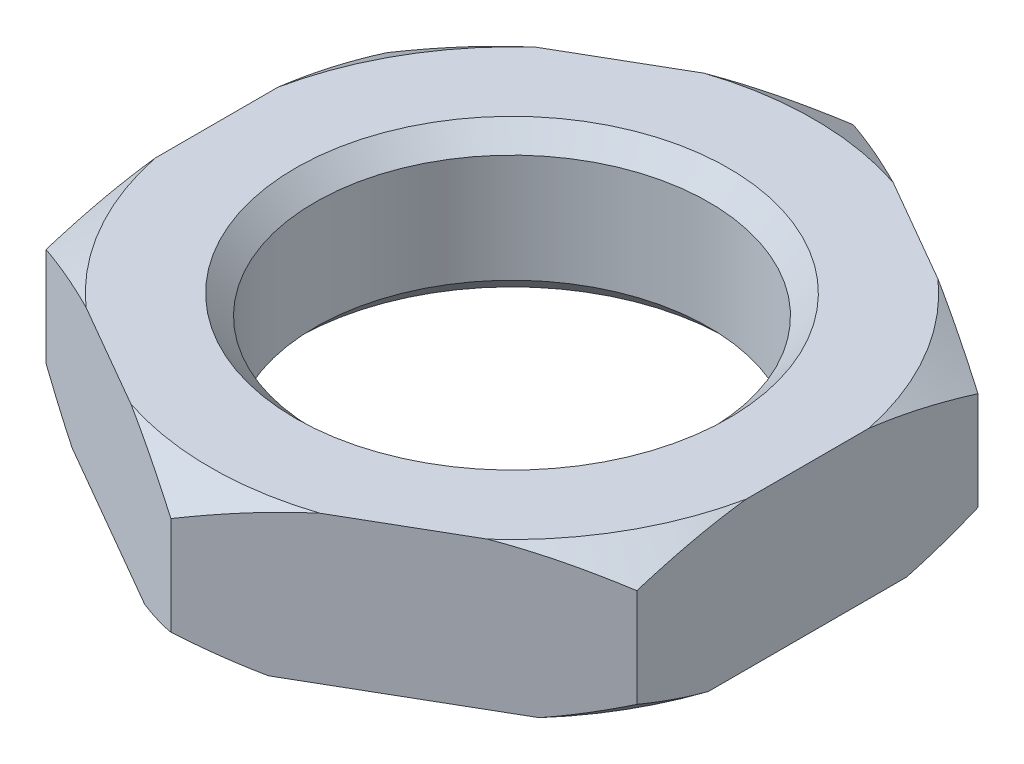
ISO-10303-21;
HEADER;
FILE_DESCRIPTION(('STEP AP214'),'2;1');
FILE_NAME('part.step','',(''),(''),'','','');
FILE_SCHEMA(('AUTOMOTIVE_DESIGN { 1 0 10303 214 1 1 1 1 }'));
ENDSEC;
DATA;
#1=APPLICATION_CONTEXT('core data for automotive mechanical design processes');
#2=APPLICATION_PROTOCOL_DEFINITION('international standard','automotive_design',2000,#1);
#3=PRODUCT_CONTEXT('',#1,'mechanical');
#4=PRODUCT('Part','Part','',(#3));
#5=PRODUCT_RELATED_PRODUCT_CATEGORY('part','',(#4));
#6=PRODUCT_DEFINITION_FORMATION('','',#4);
#7=PRODUCT_DEFINITION_CONTEXT('part definition',#1,'design');
#8=PRODUCT_DEFINITION('design','',#6,#7);
#9=PRODUCT_DEFINITION_SHAPE('','',#8);
#10=(LENGTH_UNIT() NAMED_UNIT(*) SI_UNIT(.MILLI.,.METRE.));
#11=(NAMED_UNIT(*) PLANE_ANGLE_UNIT() SI_UNIT($,.RADIAN.));
#12=(NAMED_UNIT(*) SI_UNIT($,.STERADIAN.) SOLID_ANGLE_UNIT());
#13=UNCERTAINTY_MEASURE_WITH_UNIT(LENGTH_MEASURE(1.E-05),#10,'distance_accuracy_value','');
#14=(GEOMETRIC_REPRESENTATION_CONTEXT(3) GLOBAL_UNCERTAINTY_ASSIGNED_CONTEXT((#13)) GLOBAL_UNIT_ASSIGNED_CONTEXT((#10,
#11,#12)) REPRESENTATION_CONTEXT('',''));
#15=CARTESIAN_POINT('',(0.,0.,0.));
#16=DIRECTION('',(0.,0.,1.));
#17=DIRECTION('',(1.,0.,0.));
#18=AXIS2_PLACEMENT_3D('',#15,#16,#17);
#19=CARTESIAN_POINT('',(0.,1.5,0.));
#20=DIRECTION('',(0.,1.,0.));
#21=DIRECTION('',(0.,0.,1.));
#22=AXIS2_PLACEMENT_3D('',#19,#20,#21);
#23=PLANE('',#22);
#24=CARTESIAN_POINT('',(0.,1.5,0.));
#25=DIRECTION('',(0.,1.,0.));
#26=DIRECTION('',(0.,0.,1.));
#27=AXIS2_PLACEMENT_3D('',#24,#25,#26);
#28=CIRCLE('',#27,2.2);
#29=CARTESIAN_POINT('',(0.,1.5,2.2));
#30=VERTEX_POINT('',#29);
#31=EDGE_CURVE('E207',#30,#30,#28,.F.);
#32=ORIENTED_EDGE('',*,*,#31,.T.);
#33=EDGE_LOOP('',(#32));
#34=FACE_BOUND('',#33,.T.);
#35=CARTESIAN_POINT('',(0.,1.5,0.));
#36=DIRECTION('',(0.,1.,0.));
#37=DIRECTION('',(0.,0.,1.));
#38=AXIS2_PLACEMENT_3D('',#35,#36,#37);
#39=CIRCLE('',#38,3.06410161513776);
#40=CARTESIAN_POINT('',(-2.03994354419448,1.5,2.28633966076545));
#41=VERTEX_POINT('',#40);
#42=CARTESIAN_POINT('',(-2.99999999999999,1.5,0.623473101175866));
#43=VERTEX_POINT('',#42);
#44=EDGE_CURVE('E11',#41,#43,#39,.F.);
#45=ORIENTED_EDGE('',*,*,#44,.F.);
#46=DIRECTION('',(0.866025403784441,0.,0.499999999999995));
#47=VECTOR('',#46,1.);
#48=CARTESIAN_POINT('',(-2.99999999999998,1.5,1.73205080756891));
#49=LINE('',#48,#47);
#50=CARTESIAN_POINT('',(-0.960056455805504,1.5,2.90981276194122));
#51=VERTEX_POINT('',#50);
#52=EDGE_CURVE('E255',#41,#51,#49,.T.);
#53=ORIENTED_EDGE('',*,*,#52,.T.);
#54=CARTESIAN_POINT('',(0.960056455805468,1.5,2.90981276194123));
#55=VERTEX_POINT('',#54);
#56=EDGE_CURVE('E46',#55,#51,#39,.F.);
#57=ORIENTED_EDGE('',*,*,#56,.F.);
#58=DIRECTION('',(0.866025403784438,0.,-0.500000000000001));
#59=VECTOR('',#58,1.);
#60=CARTESIAN_POINT('',(0.,1.5,3.46410161513776));
#61=LINE('',#60,#59);
#62=CARTESIAN_POINT('',(2.03994354419454,1.5,2.2863396607654));
#63=VERTEX_POINT('',#62);
#64=EDGE_CURVE('E289',#55,#63,#61,.T.);
#65=ORIENTED_EDGE('',*,*,#64,.T.);
#66=CARTESIAN_POINT('',(3.,1.5,0.623473101175824));
#67=VERTEX_POINT('',#66);
#68=EDGE_CURVE('E221',#67,#63,#39,.F.);
#69=ORIENTED_EDGE('',*,*,#68,.F.);
#70=DIRECTION('',(0.,0.,-1.));
#71=VECTOR('',#70,1.);
#72=CARTESIAN_POINT('',(3.00000000000001,1.5,1.73205080756887));
#73=LINE('',#72,#71);
#74=CARTESIAN_POINT('',(3.,1.5,-0.623473101175845));
#75=VERTEX_POINT('',#74);
#76=EDGE_CURVE('E277',#67,#75,#73,.T.);
#77=ORIENTED_EDGE('',*,*,#76,.T.);
#78=CARTESIAN_POINT('',(2.03994354419453,1.5,-2.28633966076541));
#79=VERTEX_POINT('',#78);
#80=EDGE_CURVE('E286',#79,#75,#39,.F.);
#81=ORIENTED_EDGE('',*,*,#80,.F.);
#82=DIRECTION('',(-0.866025403784442,0.,-0.499999999999995));
#83=VECTOR('',#82,1.);
#84=CARTESIAN_POINT('',(2.99999999999999,1.5,-1.73205080756889));
#85=LINE('',#84,#83);
#86=CARTESIAN_POINT('',(0.960056455805444,1.5,-2.90981276194124));
#87=VERTEX_POINT('',#86);
#88=EDGE_CURVE('E288',#79,#87,#85,.T.);
#89=ORIENTED_EDGE('',*,*,#88,.T.);
#90=CARTESIAN_POINT('',(-0.960056455805485,1.5,-2.90981276194123));
#91=VERTEX_POINT('',#90);
#92=EDGE_CURVE('E654',#91,#87,#39,.F.);
#93=ORIENTED_EDGE('',*,*,#92,.F.);
#94=DIRECTION('',(-0.866025403784435,0.,0.500000000000007));
#95=VECTOR('',#94,1.);
#96=CARTESIAN_POINT('',(0.,1.5,-3.46410161513776));
#97=LINE('',#96,#95);
#98=CARTESIAN_POINT('',(-2.03994354419456,1.5,-2.28633966076538));
#99=VERTEX_POINT('',#98);
#100=EDGE_CURVE('E291',#91,#99,#97,.T.);
#101=ORIENTED_EDGE('',*,*,#100,.T.);
#102=CARTESIAN_POINT('',(-3.00000000000001,1.5,-0.623473101175803));
#103=VERTEX_POINT('',#102);
#104=EDGE_CURVE('E51',#103,#99,#39,.F.);
#105=ORIENTED_EDGE('',*,*,#104,.F.);
#106=DIRECTION('',(0.,0.,1.));
#107=VECTOR('',#106,1.);
#108=CARTESIAN_POINT('',(-3.00000000000002,1.5,-1.73205080756885));
#109=LINE('',#108,#107);
#110=EDGE_CURVE('E260',#103,#43,#109,.T.);
#111=ORIENTED_EDGE('',*,*,#110,.T.);
#112=EDGE_LOOP('',(#45,#53,#57,#65,#69,#77,#81,#89,#93,#101,#105,#111));
#113=FACE_BOUND('',#112,.T.);
#114=ADVANCED_FACE('F41',(#34,#113),#23,.T.);
#115=CARTESIAN_POINT('',(-2.99999999999998,1.5,1.73205080756891));
#116=DIRECTION('',(0.499999999999995,0.,-0.866025403784441));
#117=DIRECTION('',(-0.866025403784442,0.,-0.499999999999995));
#118=AXIS2_PLACEMENT_3D('',#115,#116,#117);
#119=PLANE('',#118);
#120=DIRECTION('',(0.,-1.,0.));
#121=VECTOR('',#120,1.);
#122=CARTESIAN_POINT('',(0.,1.5,3.46410161513776));
#123=LINE('',#122,#121);
#124=CARTESIAN_POINT('',(0.,1.25,3.46410161513776));
#125=VERTEX_POINT('',#124);
#126=CARTESIAN_POINT('',(0.,0.25,3.46410161513776));
#127=VERTEX_POINT('',#126);
#128=EDGE_CURVE('E183',#125,#127,#123,.T.);
#129=ORIENTED_EDGE('',*,*,#128,.F.);
#130=CARTESIAN_POINT('',(0.0007,1.24974736505901,3.46450576032619));
#131=CARTESIAN_POINT('',(-0.132118584401436,1.29770203539369,3.38782291486864));
#132=CARTESIAN_POINT('',(-0.266280677223476,1.34135896938019,3.31036439446279));
#133=CARTESIAN_POINT('',(-0.537346844665793,1.41752411455504,3.15386426972177));
#134=CARTESIAN_POINT('',(-0.67425778770567,1.44999936573445,3.07481869990269));
#135=CARTESIAN_POINT('',(-0.946088347128595,1.5001961423526,2.9178772532459));
#136=CARTESIAN_POINT('',(-1.08095021548076,1.51831897963956,2.84001471724937));
#137=CARTESIAN_POINT('',(-1.35138509389356,1.53949642488741,2.68387906739947));
#138=CARTESIAN_POINT('',(-1.48695672552565,1.54257370569254,2.60560674938221));
#139=CARTESIAN_POINT('',(-1.7378739905643,1.53407074016064,2.46073959886782));
#140=CARTESIAN_POINT('',(-1.85327732637306,1.52456876159411,2.39411145187326));
#141=CARTESIAN_POINT('',(-2.083195561863,1.4951434282713,2.26136809672154));
#142=CARTESIAN_POINT('',(-2.19770934249718,1.47520860211639,2.19525353464647));
#143=CARTESIAN_POINT('',(-2.42815317242588,1.4256333431407,2.06220672740405));
#144=CARTESIAN_POINT('',(-2.54404411755596,1.39575690138364,1.99529705903656));
#145=CARTESIAN_POINT('',(-2.77383098348567,1.32819178909225,1.8626295501358));
#146=CARTESIAN_POINT('',(-2.88773092971335,1.29052151704235,1.79686938552057));
#147=CARTESIAN_POINT('',(-3.00069999999998,1.24974736505901,1.73164666238048));
#148=B_SPLINE_CURVE_WITH_KNOTS('',3,(#130,#131,#132,#133,#134,#135,#136,#137,#138,#139,#140,
#141,#142,#143,#144,#145,#146,#147),.UNSPECIFIED.,.F.,.F.,(4,2,2,2,2,2,2,2,4),(0.,
0.482303869776431,0.966017483756613,1.43567462842446,1.90462380643614,2.30497469449498,
2.70576671462179,3.11684716030584,3.52696804141059),.UNSPECIFIED.);
#149=EDGE_CURVE('E299',#125,#51,#148,.T.);
#150=ORIENTED_EDGE('',*,*,#149,.T.);
#151=ORIENTED_EDGE('',*,*,#52,.F.);
#152=CARTESIAN_POINT('',(-2.99999999999998,1.25,1.73205080756891));
#153=VERTEX_POINT('',#152);
#154=EDGE_CURVE('E301',#41,#153,#148,.T.);
#155=ORIENTED_EDGE('',*,*,#154,.T.);
#156=DIRECTION('',(0.,-1.,0.));
#157=VECTOR('',#156,1.);
#158=CARTESIAN_POINT('',(-2.99999999999998,1.5,1.73205080756891));
#159=LINE('',#158,#157);
#160=CARTESIAN_POINT('',(-2.99999999999998,0.25,1.73205080756891));
#161=VERTEX_POINT('',#160);
#162=EDGE_CURVE('E256',#153,#161,#159,.T.);
#163=ORIENTED_EDGE('',*,*,#162,.T.);
#164=CARTESIAN_POINT('',(-3.00069999999998,0.250336846587991,1.73164666238048));
#165=CARTESIAN_POINT('',(-2.89915494804903,0.201488907967232,1.79027372545924));
#166=CARTESIAN_POINT('',(-2.79638007383815,0.155716884952471,1.84961082675082));
#167=CARTESIAN_POINT('',(-2.58808496863268,0.0720995554684667,1.96987006181207));
#168=CARTESIAN_POINT('',(-2.48255693377003,0.0342803638316828,2.03079670114708));
#169=CARTESIAN_POINT('',(-2.27010836935601,-0.0310140637447712,2.15345393700046));
#170=CARTESIAN_POINT('',(-2.16320956222869,-0.0585812039591016,2.21517199207147));
#171=CARTESIAN_POINT('',(-1.947730613772,-0.101921714201025,2.33957882096764));
#172=CARTESIAN_POINT('',(-1.83915269499159,-0.117709505311277,2.40226631160355));
#173=CARTESIAN_POINT('',(-1.61928750206901,-0.136371223661096,2.52920553992283));
#174=CARTESIAN_POINT('',(-1.50798552662789,-0.139021344575427,2.5934657654051));
#175=CARTESIAN_POINT('',(-1.28573745900257,-0.13054306524596,2.72178074707545));
#176=CARTESIAN_POINT('',(-1.17479154946977,-0.119408465179738,2.7858353978097));
#177=CARTESIAN_POINT('',(-0.954465542969872,-0.0843771979488909,2.91304067697189));
#178=CARTESIAN_POINT('',(-0.845085413561052,-0.0604807955928022,2.97619132413006));
#179=CARTESIAN_POINT('',(-0.628542084799696,-0.00176156356192382,3.10121267328165));
#180=CARTESIAN_POINT('',(-0.521379827290569,0.0330658105450128,3.16308283150151));
#181=CARTESIAN_POINT('',(-0.344899381794173,0.0984796604321558,3.26497386421556));
#182=CARTESIAN_POINT('',(-0.274879393082677,0.126606688526461,3.3053999235468));
#183=CARTESIAN_POINT('',(-0.136168400788723,0.18613972375121,3.38548475228727));
#184=CARTESIAN_POINT('',(-0.0674736021716006,0.217533904380575,3.42514571276079));
#185=CARTESIAN_POINT('',(0.00070000000003283,0.250336846587874,3.46450576032621));
#186=B_SPLINE_CURVE_WITH_KNOTS('',3,(#164,#165,#166,#167,#168,#169,#170,#171,#172,#173,#174,
#175,#176,#177,#178,#179,#180,#181,#182,#183,#184,#185),.UNSPECIFIED.,.F.,.F.,(4,2,2,2,2,2,2,2,
2,2,4),(0.,0.38121603524856,0.763664974742394,1.14259772670861,1.52106579867398,
1.90595961058781,2.29102659542605,2.67608559040046,3.06130488196879,3.31804931282741,
3.57389473057061),.UNSPECIFIED.);
#187=CARTESIAN_POINT('',(-2.37100761947756,0.,2.09519972778175));
#188=VERTEX_POINT('',#187);
#189=EDGE_CURVE('E188',#161,#188,#186,.T.);
#190=ORIENTED_EDGE('',*,*,#189,.T.);
#191=DIRECTION('',(0.866025403784441,0.,0.499999999999995));
#192=VECTOR('',#191,1.);
#193=CARTESIAN_POINT('',(-2.99999999999998,0.,1.73205080756891));
#194=LINE('',#193,#192);
#195=CARTESIAN_POINT('',(-0.628992380522426,0.,3.10095269492492));
#196=VERTEX_POINT('',#195);
#197=EDGE_CURVE('E186',#188,#196,#194,.T.);
#198=ORIENTED_EDGE('',*,*,#197,.T.);
#199=EDGE_CURVE('E169',#196,#127,#186,.T.);
#200=ORIENTED_EDGE('',*,*,#199,.T.);
#201=EDGE_LOOP('',(#129,#150,#151,#155,#163,#190,#198,#200));
#202=FACE_BOUND('',#201,.T.);
#203=ADVANCED_FACE('F181',(#202),#119,.F.);
#204=CARTESIAN_POINT('',(0.,1.5,3.46410161513776));
#205=DIRECTION('',(-0.500000000000001,0.,-0.866025403784438));
#206=DIRECTION('',(-0.866025403784438,0.,0.500000000000001));
#207=AXIS2_PLACEMENT_3D('',#204,#205,#206);
#208=PLANE('',#207);
#209=DIRECTION('',(0.,-1.,0.));
#210=VECTOR('',#209,1.);
#211=CARTESIAN_POINT('',(3.00000000000001,1.5,1.73205080756887));
#212=LINE('',#211,#210);
#213=CARTESIAN_POINT('',(3.00000000000001,1.25,1.73205080756887));
#214=VERTEX_POINT('',#213);
#215=CARTESIAN_POINT('',(3.00000000000001,0.25,1.73205080756887));
#216=VERTEX_POINT('',#215);
#217=EDGE_CURVE('E195',#214,#216,#212,.T.);
#218=ORIENTED_EDGE('',*,*,#217,.F.);
#219=CARTESIAN_POINT('',(3.00070000000001,1.24974736505901,1.73164666238044));
#220=CARTESIAN_POINT('',(2.86788141559857,1.29770203539369,1.80832950783799));
#221=CARTESIAN_POINT('',(2.73371932277653,1.34135896938019,1.88578802824384));
#222=CARTESIAN_POINT('',(2.46265315533422,1.41752411455505,2.04228815298486));
#223=CARTESIAN_POINT('',(2.32574221229434,1.44999936573445,2.12133372280394));
#224=CARTESIAN_POINT('',(2.05391165287142,1.5001961423526,2.27827516946073));
#225=CARTESIAN_POINT('',(1.91904978451926,1.51831897963956,2.35613770545727));
#226=CARTESIAN_POINT('',(1.64861490610645,1.53949642488741,2.51227335530717));
#227=CARTESIAN_POINT('',(1.51304327447437,1.54257370569255,2.59054567332443));
#228=CARTESIAN_POINT('',(1.26212600943571,1.53407074016064,2.73541282383882));
#229=CARTESIAN_POINT('',(1.14672267362695,1.52456876159412,2.80204097083339));
#230=CARTESIAN_POINT('',(0.916804438137005,1.49514342827131,2.93478432598511));
#231=CARTESIAN_POINT('',(0.80229065750282,1.4752086021164,3.00089888806018));
#232=CARTESIAN_POINT('',(0.571846827574115,1.42563334314071,3.13394569530261));
#233=CARTESIAN_POINT('',(0.455955882444037,1.39575690138364,3.2008553636701));
#234=CARTESIAN_POINT('',(0.226169016514321,1.32819178909225,3.33352287257086));
#235=CARTESIAN_POINT('',(0.112269070286633,1.29052151704235,3.3992830371861));
#236=CARTESIAN_POINT('',(-0.000699999999999815,1.24974736505901,3.46450576032619));
#237=B_SPLINE_CURVE_WITH_KNOTS('',3,(#219,#220,#221,#222,#223,#224,#225,#226,#227,#228,#229,
#230,#231,#232,#233,#234,#235,#236),.UNSPECIFIED.,.F.,.F.,(4,2,2,2,2,2,2,2,4),(0.,
0.48230386977643,0.966017483756613,1.43567462842446,1.90462380643614,2.30497469449499,
2.70576671462181,3.11684716030587,3.52696804141063),.UNSPECIFIED.);
#238=EDGE_CURVE('E304',#214,#63,#237,.T.);
#239=ORIENTED_EDGE('',*,*,#238,.T.);
#240=ORIENTED_EDGE('',*,*,#64,.F.);
#241=EDGE_CURVE('E193',#55,#125,#237,.T.);
#242=ORIENTED_EDGE('',*,*,#241,.T.);
#243=ORIENTED_EDGE('',*,*,#128,.T.);
#244=CARTESIAN_POINT('',(-0.000700000000000005,0.250336846587992,3.46450576032619));
#245=CARTESIAN_POINT('',(0.100845051950952,0.201488907967232,3.40587869724743));
#246=CARTESIAN_POINT('',(0.203619926161829,0.15571688495247,3.34654159595585));
#247=CARTESIAN_POINT('',(0.4119150313673,0.072099555468464,3.22628236089459));
#248=CARTESIAN_POINT('',(0.517443066229953,0.0342803638316791,3.16535572155959));
#249=CARTESIAN_POINT('',(0.72989163064397,-0.0310140637447763,3.04269848570621));
#250=CARTESIAN_POINT('',(0.83679043777129,-0.0585812039591071,2.9809804306352));
#251=CARTESIAN_POINT('',(1.05226938622798,-0.101921714201032,2.85657360173903));
#252=CARTESIAN_POINT('',(1.16084730500839,-0.117709505311285,2.79388611110311));
#253=CARTESIAN_POINT('',(1.38071249793097,-0.136371223661105,2.66694688278383));
#254=CARTESIAN_POINT('',(1.49201447337209,-0.139021344575437,2.60268665730156));
#255=CARTESIAN_POINT('',(1.71426254099741,-0.130543065245972,2.47437167563121));
#256=CARTESIAN_POINT('',(1.82520845053021,-0.11940846517975,2.41031702489696));
#257=CARTESIAN_POINT('',(2.04553445703011,-0.0843771979489038,2.28311174573477));
#258=CARTESIAN_POINT('',(2.15491458643893,-0.0604807955928153,2.21996109857659));
#259=CARTESIAN_POINT('',(2.37145791520028,-0.00176156356193707,2.094939749425));
#260=CARTESIAN_POINT('',(2.47862017270941,0.0330658105449996,2.03306959120514));
#261=CARTESIAN_POINT('',(2.65510061820581,0.0984796604321442,1.93117855849109));
#262=CARTESIAN_POINT('',(2.72512060691731,0.126606688526451,1.89075249915985));
#263=CARTESIAN_POINT('',(2.86383159921127,0.186139723751204,1.81066767041937));
#264=CARTESIAN_POINT('',(2.9325263978284,0.217533904380571,1.77100670994584));
#265=CARTESIAN_POINT('',(3.00070000000004,0.250336846587873,1.73164666238042));
#266=B_SPLINE_CURVE_WITH_KNOTS('',3,(#244,#245,#246,#247,#248,#249,#250,#251,#252,#253,#254,
#255,#256,#257,#258,#259,#260,#261,#262,#263,#264,#265),.UNSPECIFIED.,.F.,.F.,(4,2,2,2,2,2,2,2,
2,2,4),(0.,0.381216035248561,0.763664974742397,1.14259772670861,1.52106579867398,
1.90595961058781,2.29102659542606,2.67608559040047,3.0613048819688,3.31804931282744,
3.57389473057065),.UNSPECIFIED.);
#267=CARTESIAN_POINT('',(0.628992380522411,0.,3.10095269492492));
#268=VERTEX_POINT('',#267);
#269=EDGE_CURVE('E166',#127,#268,#266,.T.);
#270=ORIENTED_EDGE('',*,*,#269,.T.);
#271=DIRECTION('',(0.866025403784438,0.,-0.500000000000001));
#272=VECTOR('',#271,1.);
#273=CARTESIAN_POINT('',(0.,0.,3.46410161513776));
#274=LINE('',#273,#272);
#275=CARTESIAN_POINT('',(2.3710076194776,0.,2.09519972778171));
#276=VERTEX_POINT('',#275);
#277=EDGE_CURVE('E245',#268,#276,#274,.T.);
#278=ORIENTED_EDGE('',*,*,#277,.T.);
#279=EDGE_CURVE('E176',#276,#216,#266,.T.);
#280=ORIENTED_EDGE('',*,*,#279,.T.);
#281=EDGE_LOOP('',(#218,#239,#240,#242,#243,#270,#278,#280));
#282=FACE_BOUND('',#281,.T.);
#283=ADVANCED_FACE('F191',(#282),#208,.F.);
#284=CARTESIAN_POINT('',(3.00000000000001,1.5,1.73205080756887));
#285=DIRECTION('',(-1.,0.,0.));
#286=DIRECTION('',(0.,0.,1.));
#287=AXIS2_PLACEMENT_3D('',#284,#285,#286);
#288=PLANE('',#287);
#289=DIRECTION('',(0.,-1.,0.));
#290=VECTOR('',#289,1.);
#291=CARTESIAN_POINT('',(2.99999999999999,1.5,-1.73205080756889));
#292=LINE('',#291,#290);
#293=CARTESIAN_POINT('',(2.99999999999999,1.25,-1.73205080756889));
#294=VERTEX_POINT('',#293);
#295=CARTESIAN_POINT('',(3.,0.25,-1.73205080756889));
#296=VERTEX_POINT('',#295);
#297=EDGE_CURVE('E201',#294,#296,#292,.T.);
#298=ORIENTED_EDGE('',*,*,#297,.F.);
#299=CARTESIAN_POINT('',(2.99999999999999,1.24978121685082,-1.73275080756889));
#300=CARTESIAN_POINT('',(3.,1.29773311987396,-1.57938686178308));
#301=CARTESIAN_POINT('',(3.,1.34138709875567,-1.42447157461167));
#302=CARTESIAN_POINT('',(3.,1.4175460772468,-1.1114750465204));
#303=CARTESIAN_POINT('',(3.,1.45001812168552,-0.953385876346141));
#304=CARTESIAN_POINT('',(3.,1.50020855662903,-0.639506831145959));
#305=CARTESIAN_POINT('',(3.,1.51832823682832,-0.483783626585099));
#306=CARTESIAN_POINT('',(3.,1.53949957144276,-0.171516329793899));
#307=CARTESIAN_POINT('',(3.,1.54257389544858,-0.0149738285735925));
#308=CARTESIAN_POINT('',(3.,1.53406636255947,0.274742106784963));
#309=CARTESIAN_POINT('',(3.,1.52456388534034,0.407982245462482));
#310=CARTESIAN_POINT('',(3.,1.49514017883211,0.673436801015346));
#311=CARTESIAN_POINT('',(3.,1.47520748525118,0.805649926452655));
#312=CARTESIAN_POINT('',(3.,1.42563882293337,1.07171101637478));
#313=CARTESIAN_POINT('',(3.,1.39576694075561,1.20551384626384));
#314=CARTESIAN_POINT('',(3.00000000000001,1.32821263003657,1.47081649542448));
#315=CARTESIAN_POINT('',(3.00000000000001,1.29054859002607,1.60232096017711));
#316=CARTESIAN_POINT('',(3.00000000000001,1.24978121685082,1.73275080756887));
#317=B_SPLINE_CURVE_WITH_KNOTS('',3,(#299,#300,#301,#302,#303,#304,#305,#306,#307,#308,#309,
#310,#311,#312,#313,#314,#315,#316),.UNSPECIFIED.,.F.,.F.,(4,2,2,2,2,2,2,2,4),(0.,
0.482296383665923,0.966002254400431,1.43565273704662,1.9045953554841,2.304898183613,
2.70564192859114,3.11667114933176,3.52674123536059),.UNSPECIFIED.);
#318=EDGE_CURVE('E274',#294,#75,#317,.T.);
#319=ORIENTED_EDGE('',*,*,#318,.T.);
#320=ORIENTED_EDGE('',*,*,#76,.F.);
#321=EDGE_CURVE('E279',#67,#214,#317,.T.);
#322=ORIENTED_EDGE('',*,*,#321,.T.);
#323=ORIENTED_EDGE('',*,*,#217,.T.);
#324=CARTESIAN_POINT('',(3.00000000000001,0.25029171086558,1.73275080756887));
#325=CARTESIAN_POINT('',(3.00000000000001,0.201446956875468,1.61549886089136));
#326=CARTESIAN_POINT('',(3.00000000000001,0.155678218223293,1.496826859769));
#327=CARTESIAN_POINT('',(3.,0.0720675842305005,1.25631296321272));
#328=CARTESIAN_POINT('',(3.,0.0342518020699321,1.1344620577695));
#329=CARTESIAN_POINT('',(3.,-0.0310358407371556,0.889152502110064));
#330=CARTESIAN_POINT('',(3.,-0.0585996029659486,0.765718931965321));
#331=CARTESIAN_POINT('',(3.,-0.10193356544899,0.516910653127829));
#332=CARTESIAN_POINT('',(3.,-0.117718185966363,0.391538510334202));
#333=CARTESIAN_POINT('',(3.,-0.13637398107492,0.137666431125039));
#334=CARTESIAN_POINT('',(3.,-0.139021391763878,0.00914952729728644));
#335=CARTESIAN_POINT('',(3.,-0.130538540892742,-0.247473111661502));
#336=CARTESIAN_POINT('',(3.,-0.119402079098167,-0.375578635751668));
#337=CARTESIAN_POINT('',(3.,-0.0843680385848753,-0.629981535228391));
#338=CARTESIAN_POINT('',(3.,-0.0604707290198154,-0.756278948694191));
#339=CARTESIAN_POINT('',(3.,-0.00175054794840804,-1.00631396029706));
#340=CARTESIAN_POINT('',(3.,0.0330768663626798,-1.13005047122855));
#341=CARTESIAN_POINT('',(3.,0.0984831636038373,-1.33380435744699));
#342=CARTESIAN_POINT('',(3.,0.126601729260458,-1.41463240905061));
#343=CARTESIAN_POINT('',(2.99999999999999,0.186115962831797,-1.5747548146694));
#344=CARTESIAN_POINT('',(2.99999999999999,0.217499813500629,-1.65405354730035));
#345=CARTESIAN_POINT('',(2.99999999999999,0.250291710865463,-1.73275080756893));
#346=B_SPLINE_CURVE_WITH_KNOTS('',3,(#324,#325,#326,#327,#328,#329,#330,#331,#332,#333,#334,
#335,#336,#337,#338,#339,#340,#341,#342,#343,#344,#345),.UNSPECIFIED.,.F.,.F.,(4,2,2,2,2,2,2,2,
2,2,4),(0.,0.381206318316975,0.763645415435202,1.14256852119922,1.5210269771878,
1.90591004149772,2.2909662960886,2.67601442933778,3.06122280992506,3.31789077494278,
3.57366018519406),.UNSPECIFIED.);
#347=CARTESIAN_POINT('',(3.,0.,1.0057529671432));
#348=VERTEX_POINT('',#347);
#349=EDGE_CURVE('E244',#216,#348,#346,.T.);
#350=ORIENTED_EDGE('',*,*,#349,.T.);
#351=DIRECTION('',(0.,0.,-1.));
#352=VECTOR('',#351,1.);
#353=CARTESIAN_POINT('',(3.00000000000001,0.,1.73205080756887));
#354=LINE('',#353,#352);
#355=CARTESIAN_POINT('',(3.,0.,-1.00575296714322));
#356=VERTEX_POINT('',#355);
#357=EDGE_CURVE('E233',#348,#356,#354,.T.);
#358=ORIENTED_EDGE('',*,*,#357,.T.);
#359=EDGE_CURVE('E242',#356,#296,#346,.T.);
#360=ORIENTED_EDGE('',*,*,#359,.T.);
#361=EDGE_LOOP('',(#298,#319,#320,#322,#323,#350,#358,#360));
#362=FACE_BOUND('',#361,.T.);
#363=ADVANCED_FACE('F241',(#362),#288,.F.);
#364=CARTESIAN_POINT('',(2.99999999999999,1.5,-1.73205080756889));
#365=DIRECTION('',(-0.499999999999995,0.,0.866025403784441));
#366=DIRECTION('',(0.866025403784442,0.,0.499999999999995));
#367=AXIS2_PLACEMENT_3D('',#364,#365,#366);
#368=PLANE('',#367);
#369=DIRECTION('',(0.,-1.,0.));
#370=VECTOR('',#369,1.);
#371=CARTESIAN_POINT('',(0.,1.5,-3.46410161513776));
#372=LINE('',#371,#370);
#373=CARTESIAN_POINT('',(0.,1.25,-3.46410161513776));
#374=VERTEX_POINT('',#373);
#375=CARTESIAN_POINT('',(0.,0.25,-3.46410161513776));
#376=VERTEX_POINT('',#375);
#377=EDGE_CURVE('E263',#374,#376,#372,.T.);
#378=ORIENTED_EDGE('',*,*,#377,.F.);
#379=CARTESIAN_POINT('',(-0.00070000000002419,1.24974736505901,-3.46450576032619));
#380=CARTESIAN_POINT('',(0.132118584401412,1.2977020353937,-3.38782291486864));
#381=CARTESIAN_POINT('',(0.266280677223451,1.34135896938019,-3.31036439446279));
#382=CARTESIAN_POINT('',(0.537346844665768,1.41752411455505,-3.15386426972177));
#383=CARTESIAN_POINT('',(0.674257787705645,1.44999936573445,-3.07481869990269));
#384=CARTESIAN_POINT('',(0.94608834712857,1.5001961423526,-2.9178772532459));
#385=CARTESIAN_POINT('',(1.08095021548073,1.51831897963956,-2.84001471724937));
#386=CARTESIAN_POINT('',(1.35138509389354,1.53949642488741,-2.68387906739947));
#387=CARTESIAN_POINT('',(1.48695672552562,1.54257370569255,-2.60560674938221));
#388=CARTESIAN_POINT('',(1.73787399056428,1.53407074016064,-2.46073959886782));
#389=CARTESIAN_POINT('',(1.85327732637304,1.52456876159412,-2.39411145187325));
#390=CARTESIAN_POINT('',(2.08319556186299,1.49514342827131,-2.26136809672153));
#391=CARTESIAN_POINT('',(2.19770934249717,1.4752086021164,-2.19525353464646));
#392=CARTESIAN_POINT('',(2.42815317242588,1.42563334314071,-2.06220672740404));
#393=CARTESIAN_POINT('',(2.54404411755596,1.39575690138364,-1.99529705903655));
#394=CARTESIAN_POINT('',(2.77383098348567,1.32819178909225,-1.86262955013579));
#395=CARTESIAN_POINT('',(2.88773092971336,1.29052151704235,-1.79686938552055));
#396=CARTESIAN_POINT('',(3.00069999999999,1.24974736505901,-1.73164666238046));
#397=B_SPLINE_CURVE_WITH_KNOTS('',3,(#379,#380,#381,#382,#383,#384,#385,#386,#387,#388,#389,
#390,#391,#392,#393,#394,#395,#396),.UNSPECIFIED.,.F.,.F.,(4,2,2,2,2,2,2,2,4),(0.,
0.48230386977643,0.966017483756613,1.43567462842446,1.90462380643614,2.30497469449499,
2.70576671462181,3.11684716030587,3.52696804141063),.UNSPECIFIED.);
#398=EDGE_CURVE('E317',#374,#87,#397,.T.);
#399=ORIENTED_EDGE('',*,*,#398,.T.);
#400=ORIENTED_EDGE('',*,*,#88,.F.);
#401=EDGE_CURVE('E271',#79,#294,#397,.T.);
#402=ORIENTED_EDGE('',*,*,#401,.T.);
#403=ORIENTED_EDGE('',*,*,#297,.T.);
#404=CARTESIAN_POINT('',(3.00069999999999,0.250336846587991,-1.73164666238046));
#405=CARTESIAN_POINT('',(2.89915494804904,0.201488907967231,-1.79027372545922));
#406=CARTESIAN_POINT('',(2.79638007383817,0.155716884952469,-1.84961082675079));
#407=CARTESIAN_POINT('',(2.58808496863269,0.0720995554684636,-1.96987006181205));
#408=CARTESIAN_POINT('',(2.48255693377004,0.0342803638316788,-2.03079670114706));
#409=CARTESIAN_POINT('',(2.27010836935602,-0.0310140637447766,-2.15345393700044));
#410=CARTESIAN_POINT('',(2.1632095622287,-0.0585812039591076,-2.21517199207145));
#411=CARTESIAN_POINT('',(1.94773061377201,-0.101921714201033,-2.33957882096761));
#412=CARTESIAN_POINT('',(1.8391526949916,-0.117709505311286,-2.40226631160353));
#413=CARTESIAN_POINT('',(1.61928750206902,-0.136371223661106,-2.52920553992281));
#414=CARTESIAN_POINT('',(1.5079855266279,-0.139021344575438,-2.59346576540508));
#415=CARTESIAN_POINT('',(1.28573745900257,-0.130543065245972,-2.72178074707543));
#416=CARTESIAN_POINT('',(1.17479154946978,-0.11940846517975,-2.78583539780968));
#417=CARTESIAN_POINT('',(0.95446554296988,-0.0843771979489042,-2.91304067697187));
#418=CARTESIAN_POINT('',(0.84508541356106,-0.0604807955928163,-2.97619132413005));
#419=CARTESIAN_POINT('',(0.628542084799703,-0.00176156356193852,-3.10121267328163));
#420=CARTESIAN_POINT('',(0.521379827290575,0.0330658105449983,-3.16308283150149));
#421=CARTESIAN_POINT('',(0.344899381794173,0.0984796604321431,-3.26497386421554));
#422=CARTESIAN_POINT('',(0.274879393082672,0.12660668852645,-3.30539992354678));
#423=CARTESIAN_POINT('',(0.136168400788708,0.186139723751203,-3.38548475228726));
#424=CARTESIAN_POINT('',(0.0674736021715813,0.217533904380571,-3.42514571276079));
#425=CARTESIAN_POINT('',(-0.000700000000056784,0.250336846587873,-3.46450576032621));
#426=B_SPLINE_CURVE_WITH_KNOTS('',3,(#404,#405,#406,#407,#408,#409,#410,#411,#412,#413,#414,
#415,#416,#417,#418,#419,#420,#421,#422,#423,#424,#425),.UNSPECIFIED.,.F.,.F.,(4,2,2,2,2,2,2,2,
2,2,4),(0.,0.381216035248561,0.763664974742397,1.14259772670861,1.52106579867398,
1.90595961058781,2.29102659542606,2.67608559040047,3.0613048819688,3.31804931282743,
3.57389473057065),.UNSPECIFIED.);
#427=CARTESIAN_POINT('',(2.37100761947758,0.,-2.09519972778173));
#428=VERTEX_POINT('',#427);
#429=EDGE_CURVE('E269',#296,#428,#426,.T.);
#430=ORIENTED_EDGE('',*,*,#429,.T.);
#431=DIRECTION('',(-0.866025403784442,0.,-0.499999999999995));
#432=VECTOR('',#431,1.);
#433=CARTESIAN_POINT('',(2.99999999999999,0.,-1.73205080756889));
#434=LINE('',#433,#432);
#435=CARTESIAN_POINT('',(0.628992380522387,0.,-3.10095269492492));
#436=VERTEX_POINT('',#435);
#437=EDGE_CURVE('E234',#428,#436,#434,.T.);
#438=ORIENTED_EDGE('',*,*,#437,.T.);
#439=EDGE_CURVE('E342',#436,#376,#426,.T.);
#440=ORIENTED_EDGE('',*,*,#439,.T.);
#441=EDGE_LOOP('',(#378,#399,#400,#402,#403,#430,#438,#440));
#442=FACE_BOUND('',#441,.T.);
#443=ADVANCED_FACE('F268',(#442),#368,.F.);
#444=CARTESIAN_POINT('',(0.,1.5,-3.46410161513776));
#445=DIRECTION('',(0.500000000000007,0.,0.866025403784435));
#446=DIRECTION('',(0.866025403784434,0.,-0.500000000000007));
#447=AXIS2_PLACEMENT_3D('',#444,#445,#446);
#448=PLANE('',#447);
#449=DIRECTION('',(0.,-1.,0.));
#450=VECTOR('',#449,1.);
#451=CARTESIAN_POINT('',(-3.00000000000002,1.5,-1.73205080756885));
#452=LINE('',#451,#450);
#453=CARTESIAN_POINT('',(-3.00000000000002,1.25,-1.73205080756885));
#454=VERTEX_POINT('',#453);
#455=CARTESIAN_POINT('',(-3.00000000000002,0.25,-1.73205080756885));
#456=VERTEX_POINT('',#455);
#457=EDGE_CURVE('E259',#454,#456,#452,.T.);
#458=ORIENTED_EDGE('',*,*,#457,.F.);
#459=CARTESIAN_POINT('',(-3.00070000000002,1.24974736505901,-1.73164666238042));
#460=CARTESIAN_POINT('',(-2.86788141559858,1.29770203539369,-1.80832950783797));
#461=CARTESIAN_POINT('',(-2.73371932277654,1.34135896938019,-1.88578802824382));
#462=CARTESIAN_POINT('',(-2.46265315533423,1.41752411455505,-2.04228815298485));
#463=CARTESIAN_POINT('',(-2.32574221229435,1.44999936573445,-2.12133372280392));
#464=CARTESIAN_POINT('',(-2.05391165287143,1.5001961423526,-2.27827516946072));
#465=CARTESIAN_POINT('',(-1.91904978451927,1.51831897963956,-2.35613770545725));
#466=CARTESIAN_POINT('',(-1.64861490610647,1.53949642488741,-2.51227335530715));
#467=CARTESIAN_POINT('',(-1.51304327447439,1.54257370569255,-2.59054567332441));
#468=CARTESIAN_POINT('',(-1.26212600943573,1.53407074016064,-2.73541282383881));
#469=CARTESIAN_POINT('',(-1.14672267362697,1.52456876159412,-2.80204097083338));
#470=CARTESIAN_POINT('',(-0.916804438137025,1.49514342827131,-2.93478432598511));
#471=CARTESIAN_POINT('',(-0.802290657502841,1.4752086021164,-3.00089888806018));
#472=CARTESIAN_POINT('',(-0.571846827574137,1.42563334314071,-3.1339456953026));
#473=CARTESIAN_POINT('',(-0.455955882444059,1.39575690138364,-3.2008553636701));
#474=CARTESIAN_POINT('',(-0.226169016514344,1.32819178909225,-3.33352287257086));
#475=CARTESIAN_POINT('',(-0.112269070286656,1.29052151704235,-3.3992830371861));
#476=CARTESIAN_POINT('',(0.000699999999975717,1.24974736505901,-3.46450576032619));
#477=B_SPLINE_CURVE_WITH_KNOTS('',3,(#459,#460,#461,#462,#463,#464,#465,#466,#467,#468,#469,
#470,#471,#472,#473,#474,#475,#476),.UNSPECIFIED.,.F.,.F.,(4,2,2,2,2,2,2,2,4),(0.,
0.482303869776431,0.966017483756613,1.43567462842446,1.90462380643614,2.30497469449499,
2.70576671462181,3.11684716030587,3.52696804141063),.UNSPECIFIED.);
#478=EDGE_CURVE('E318',#454,#99,#477,.T.);
#479=ORIENTED_EDGE('',*,*,#478,.T.);
#480=ORIENTED_EDGE('',*,*,#100,.F.);
#481=EDGE_CURVE('E66',#91,#374,#477,.T.);
#482=ORIENTED_EDGE('',*,*,#481,.T.);
#483=ORIENTED_EDGE('',*,*,#377,.T.);
#484=CARTESIAN_POINT('',(0.000699999999975811,0.250336846587991,-3.46450576032619));
#485=CARTESIAN_POINT('',(-0.100845051950975,0.201488907967231,-3.40587869724743));
#486=CARTESIAN_POINT('',(-0.203619926161852,0.155716884952469,-3.34654159595585));
#487=CARTESIAN_POINT('',(-0.411915031367322,0.0720995554684634,-3.22628236089459));
#488=CARTESIAN_POINT('',(-0.517443066229974,0.034280363831679,-3.16535572155958));
#489=CARTESIAN_POINT('',(-0.72989163064399,-0.0310140637447764,-3.0426984857062));
#490=CARTESIAN_POINT('',(-0.83679043777131,-0.0585812039591076,-2.98098043063519));
#491=CARTESIAN_POINT('',(-1.052269386228,-0.101921714201033,-2.85657360173902));
#492=CARTESIAN_POINT('',(-1.16084730500841,-0.117709505311286,-2.7938861111031));
#493=CARTESIAN_POINT('',(-1.38071249793099,-0.136371223661106,-2.66694688278382));
#494=CARTESIAN_POINT('',(-1.49201447337211,-0.139021344575437,-2.60268665730155));
#495=CARTESIAN_POINT('',(-1.71426254099743,-0.130543065245972,-2.47437167563119));
#496=CARTESIAN_POINT('',(-1.82520845053023,-0.11940846517975,-2.41031702489694));
#497=CARTESIAN_POINT('',(-2.04553445703012,-0.084377197948904,-2.28311174573475));
#498=CARTESIAN_POINT('',(-2.15491458643894,-0.0604807955928159,-2.21996109857657));
#499=CARTESIAN_POINT('',(-2.3714579152003,-0.00176156356193786,-2.09493974942498));
#500=CARTESIAN_POINT('',(-2.47862017270942,0.0330658105449991,-2.03306959120512));
#501=CARTESIAN_POINT('',(-2.65510061820582,0.0984796604321437,-1.93117855849107));
#502=CARTESIAN_POINT('',(-2.72512060691733,0.12660668852645,-1.89075249915983));
#503=CARTESIAN_POINT('',(-2.86383159921129,0.186139723751203,-1.81066767041935));
#504=CARTESIAN_POINT('',(-2.93252639782841,0.217533904380571,-1.77100670994582));
#505=CARTESIAN_POINT('',(-3.00070000000005,0.250336846587873,-1.7316466623804));
#506=B_SPLINE_CURVE_WITH_KNOTS('',3,(#484,#485,#486,#487,#488,#489,#490,#491,#492,#493,#494,
#495,#496,#497,#498,#499,#500,#501,#502,#503,#504,#505),.UNSPECIFIED.,.F.,.F.,(4,2,2,2,2,2,2,2,
2,2,4),(0.,0.381216035248561,0.763664974742396,1.14259772670861,1.52106579867398,
1.90595961058781,2.29102659542606,2.67608559040047,3.0613048819688,3.31804931282744,
3.57389473057065),.UNSPECIFIED.);
#507=CARTESIAN_POINT('',(-0.62899238052243,0.,-3.10095269492491));
#508=VERTEX_POINT('',#507);
#509=EDGE_CURVE('E339',#376,#508,#506,.T.);
#510=ORIENTED_EDGE('',*,*,#509,.T.);
#511=DIRECTION('',(-0.866025403784435,0.,0.500000000000007));
#512=VECTOR('',#511,1.);
#513=CARTESIAN_POINT('',(0.,0.,-3.46410161513776));
#514=LINE('',#513,#512);
#515=CARTESIAN_POINT('',(-2.37100761947761,0.,-2.09519972778169));
#516=VERTEX_POINT('',#515);
#517=EDGE_CURVE('E247',#508,#516,#514,.T.);
#518=ORIENTED_EDGE('',*,*,#517,.T.);
#519=EDGE_CURVE('E336',#516,#456,#506,.T.);
#520=ORIENTED_EDGE('',*,*,#519,.T.);
#521=EDGE_LOOP('',(#458,#479,#480,#482,#483,#510,#518,#520));
#522=FACE_BOUND('',#521,.T.);
#523=ADVANCED_FACE('F334',(#522),#448,.F.);
#524=CARTESIAN_POINT('',(-3.00000000000002,1.5,-1.73205080756885));
#525=DIRECTION('',(1.,0.,0.));
#526=DIRECTION('',(0.,0.,-1.));
#527=AXIS2_PLACEMENT_3D('',#524,#525,#526);
#528=PLANE('',#527);
#529=ORIENTED_EDGE('',*,*,#162,.F.);
#530=CARTESIAN_POINT('',(-2.99999999999998,1.24978121685082,1.73275080756891));
#531=CARTESIAN_POINT('',(-2.99999999999998,1.29773311987396,1.5793868617831));
#532=CARTESIAN_POINT('',(-2.99999999999999,1.34138709875567,1.4244715746117));
#533=CARTESIAN_POINT('',(-2.99999999999999,1.4175460772468,1.11147504652042));
#534=CARTESIAN_POINT('',(-2.99999999999999,1.45001812168552,0.953385876346162));
#535=CARTESIAN_POINT('',(-2.99999999999999,1.50020855662903,0.63950683114598));
#536=CARTESIAN_POINT('',(-3.,1.51832823682832,0.48378362658512));
#537=CARTESIAN_POINT('',(-3.,1.53949957144276,0.17151632979392));
#538=CARTESIAN_POINT('',(-3.,1.54257389544858,0.0149738285736136));
#539=CARTESIAN_POINT('',(-3.,1.53406636255947,-0.274742106784942));
#540=CARTESIAN_POINT('',(-3.,1.52456388534034,-0.407982245462461));
#541=CARTESIAN_POINT('',(-3.00000000000001,1.49514017883211,-0.673436801015325));
#542=CARTESIAN_POINT('',(-3.00000000000001,1.47520748525118,-0.805649926452634));
#543=CARTESIAN_POINT('',(-3.00000000000001,1.42563882293337,-1.07171101637476));
#544=CARTESIAN_POINT('',(-3.00000000000001,1.39576694075562,-1.20551384626382));
#545=CARTESIAN_POINT('',(-3.00000000000002,1.32821263003657,-1.47081649542446));
#546=CARTESIAN_POINT('',(-3.00000000000002,1.29054859002607,-1.60232096017709));
#547=CARTESIAN_POINT('',(-3.00000000000002,1.24978121685082,-1.73275080756885));
#548=B_SPLINE_CURVE_WITH_KNOTS('',3,(#530,#531,#532,#533,#534,#535,#536,#537,#538,#539,#540,
#541,#542,#543,#544,#545,#546,#547),.UNSPECIFIED.,.F.,.F.,(4,2,2,2,2,2,2,2,4),(0.,
0.482296383665923,0.966002254400431,1.43565273704662,1.9045953554841,2.304898183613,
2.70564192859114,3.11667114933176,3.52674123536059),.UNSPECIFIED.);
#549=EDGE_CURVE('E315',#153,#43,#548,.T.);
#550=ORIENTED_EDGE('',*,*,#549,.T.);
#551=ORIENTED_EDGE('',*,*,#110,.F.);
#552=EDGE_CURVE('E58',#103,#454,#548,.T.);
#553=ORIENTED_EDGE('',*,*,#552,.T.);
#554=ORIENTED_EDGE('',*,*,#457,.T.);
#555=CARTESIAN_POINT('',(-3.00000000000002,0.25029171086558,-1.73275080756885));
#556=CARTESIAN_POINT('',(-3.00000000000002,0.201446956875468,-1.61549886089134));
#557=CARTESIAN_POINT('',(-3.00000000000002,0.155678218223293,-1.49682685976898));
#558=CARTESIAN_POINT('',(-3.00000000000001,0.0720675842305003,-1.2563129632127));
#559=CARTESIAN_POINT('',(-3.00000000000001,0.0342518020699318,-1.13446205776948));
#560=CARTESIAN_POINT('',(-3.00000000000001,-0.0310358407371558,-0.889152502110043));
#561=CARTESIAN_POINT('',(-3.00000000000001,-0.0585996029659485,-0.7657189319653));
#562=CARTESIAN_POINT('',(-3.00000000000001,-0.10193356544899,-0.516910653127808));
#563=CARTESIAN_POINT('',(-3.,-0.117718185966363,-0.391538510334181));
#564=CARTESIAN_POINT('',(-3.,-0.13637398107492,-0.137666431125018));
#565=CARTESIAN_POINT('',(-3.,-0.139021391763878,-0.00914952729726547));
#566=CARTESIAN_POINT('',(-3.,-0.130538540892742,0.247473111661524));
#567=CARTESIAN_POINT('',(-3.,-0.119402079098167,0.375578635751689));
#568=CARTESIAN_POINT('',(-2.99999999999999,-0.0843680385848753,0.629981535228412));
#569=CARTESIAN_POINT('',(-2.99999999999999,-0.0604707290198152,0.756278948694212));
#570=CARTESIAN_POINT('',(-2.99999999999999,-0.00175054794840781,1.00631396029709));
#571=CARTESIAN_POINT('',(-2.99999999999999,0.0330768663626798,1.13005047122857));
#572=CARTESIAN_POINT('',(-2.99999999999999,0.0984831636038371,1.33380435744701));
#573=CARTESIAN_POINT('',(-2.99999999999999,0.126601729260458,1.41463240905063));
#574=CARTESIAN_POINT('',(-2.99999999999998,0.186115962831797,1.57475481466943));
#575=CARTESIAN_POINT('',(-2.99999999999998,0.217499813500629,1.65405354730037));
#576=CARTESIAN_POINT('',(-2.99999999999998,0.250291710865463,1.73275080756895));
#577=B_SPLINE_CURVE_WITH_KNOTS('',3,(#555,#556,#557,#558,#559,#560,#561,#562,#563,#564,#565,
#566,#567,#568,#569,#570,#571,#572,#573,#574,#575,#576),.UNSPECIFIED.,.F.,.F.,(4,2,2,2,2,2,2,2,
2,2,4),(0.,0.381206318316976,0.763645415435202,1.14256852119922,1.5210269771878,
1.90591004149772,2.2909662960886,2.67601442933778,3.06122280992506,3.31789077494279,
3.57366018519406),.UNSPECIFIED.);
#578=CARTESIAN_POINT('',(-3.00000000000001,0.,-1.00575296714318));
#579=VERTEX_POINT('',#578);
#580=EDGE_CURVE('E340',#456,#579,#577,.T.);
#581=ORIENTED_EDGE('',*,*,#580,.T.);
#582=DIRECTION('',(0.,0.,1.));
#583=VECTOR('',#582,1.);
#584=CARTESIAN_POINT('',(-3.00000000000002,0.,-1.73205080756885));
#585=LINE('',#584,#583);
#586=CARTESIAN_POINT('',(-2.99999999999999,0.,1.00575296714324));
#587=VERTEX_POINT('',#586);
#588=EDGE_CURVE('E253',#579,#587,#585,.T.);
#589=ORIENTED_EDGE('',*,*,#588,.T.);
#590=EDGE_CURVE('E344',#587,#161,#577,.T.);
#591=ORIENTED_EDGE('',*,*,#590,.T.);
#592=EDGE_LOOP('',(#529,#550,#551,#553,#554,#581,#589,#591));
#593=FACE_BOUND('',#592,.T.);
#594=ADVANCED_FACE('F330',(#593),#528,.F.);
#595=CARTESIAN_POINT('',(0.,0.,0.));
#596=DIRECTION('',(0.,1.,0.));
#597=DIRECTION('',(0.,0.,1.));
#598=AXIS2_PLACEMENT_3D('',#595,#596,#597);
#599=PLANE('',#598);
#600=CARTESIAN_POINT('',(0.,0.,0.));
#601=DIRECTION('',(0.,1.,0.));
#602=DIRECTION('',(0.,0.,1.));
#603=AXIS2_PLACEMENT_3D('',#600,#601,#602);
#604=CIRCLE('',#603,2.2);
#605=CARTESIAN_POINT('',(0.,0.,2.2));
#606=VERTEX_POINT('',#605);
#607=EDGE_CURVE('E210',#606,#606,#604,.T.);
#608=ORIENTED_EDGE('',*,*,#607,.T.);
#609=EDGE_LOOP('',(#608));
#610=FACE_BOUND('',#609,.T.);
#611=ORIENTED_EDGE('',*,*,#197,.F.);
#612=CARTESIAN_POINT('',(0.,0.,0.));
#613=DIRECTION('',(0.,1.,0.));
#614=DIRECTION('',(0.,0.,1.));
#615=AXIS2_PLACEMENT_3D('',#612,#613,#614);
#616=CIRCLE('',#615,3.16410161513776);
#617=EDGE_CURVE('E213',#188,#587,#616,.F.);
#618=ORIENTED_EDGE('',*,*,#617,.T.);
#619=ORIENTED_EDGE('',*,*,#588,.F.);
#620=EDGE_CURVE('E218',#579,#516,#616,.F.);
#621=ORIENTED_EDGE('',*,*,#620,.T.);
#622=ORIENTED_EDGE('',*,*,#517,.F.);
#623=EDGE_CURVE('E223',#508,#436,#616,.F.);
#624=ORIENTED_EDGE('',*,*,#623,.T.);
#625=ORIENTED_EDGE('',*,*,#437,.F.);
#626=EDGE_CURVE('E216',#428,#356,#616,.F.);
#627=ORIENTED_EDGE('',*,*,#626,.T.);
#628=ORIENTED_EDGE('',*,*,#357,.F.);
#629=EDGE_CURVE('E212',#348,#276,#616,.F.);
#630=ORIENTED_EDGE('',*,*,#629,.T.);
#631=ORIENTED_EDGE('',*,*,#277,.F.);
#632=EDGE_CURVE('E171',#268,#196,#616,.F.);
#633=ORIENTED_EDGE('',*,*,#632,.T.);
#634=EDGE_LOOP('',(#611,#618,#619,#621,#622,#624,#625,#627,#628,#630,#631,#633));
#635=FACE_BOUND('',#634,.T.);
#636=ADVANCED_FACE('F232',(#610,#635),#599,.F.);
#637=CARTESIAN_POINT('',(0.,0.,0.));
#638=DIRECTION('',(0.,1.,0.));
#639=DIRECTION('',(0.,0.,1.));
#640=AXIS2_PLACEMENT_3D('',#637,#638,#639);
#641=CYLINDRICAL_SURFACE('',#640,2.);
#642=CARTESIAN_POINT('',(0.,1.3,0.));
#643=DIRECTION('',(0.,1.,0.));
#644=DIRECTION('',(0.,0.,1.));
#645=AXIS2_PLACEMENT_3D('',#642,#643,#644);
#646=CIRCLE('',#645,2.);
#647=CARTESIAN_POINT('',(0.,1.3,2.));
#648=VERTEX_POINT('',#647);
#649=EDGE_CURVE('E198',#648,#648,#646,.T.);
#650=ORIENTED_EDGE('',*,*,#649,.T.);
#651=EDGE_LOOP('',(#650));
#652=FACE_BOUND('',#651,.T.);
#653=CARTESIAN_POINT('',(0.,0.200000000000001,0.));
#654=DIRECTION('',(0.,1.,0.));
#655=DIRECTION('',(0.,0.,1.));
#656=AXIS2_PLACEMENT_3D('',#653,#654,#655);
#657=CIRCLE('',#656,2.);
#658=CARTESIAN_POINT('',(0.,0.200000000000001,2.));
#659=VERTEX_POINT('',#658);
#660=EDGE_CURVE('E194',#659,#659,#657,.F.);
#661=ORIENTED_EDGE('',*,*,#660,.T.);
#662=EDGE_LOOP('',(#661));
#663=FACE_BOUND('',#662,.T.);
#664=ADVANCED_FACE('F370',(#652,#663),#641,.F.);
#665=CARTESIAN_POINT('',(0.,1.3,0.));
#666=DIRECTION('',(0.,1.,0.));
#667=DIRECTION('',(0.,0.,1.));
#668=AXIS2_PLACEMENT_3D('',#665,#666,#667);
#669=CONICAL_SURFACE('',#668,2.,0.785398163397446);
#670=ORIENTED_EDGE('',*,*,#31,.F.);
#671=EDGE_LOOP('',(#670));
#672=FACE_BOUND('',#671,.T.);
#673=ORIENTED_EDGE('',*,*,#649,.F.);
#674=EDGE_LOOP('',(#673));
#675=FACE_BOUND('',#674,.T.);
#676=ADVANCED_FACE('F468',(#672,#675),#669,.F.);
#677=CARTESIAN_POINT('',(0.,0.,0.));
#678=DIRECTION('',(0.,-1.,0.));
#679=DIRECTION('',(0.,0.,-1.));
#680=AXIS2_PLACEMENT_3D('',#677,#678,#679);
#681=CONICAL_SURFACE('',#680,2.2,0.785398163397444);
#682=ORIENTED_EDGE('',*,*,#660,.F.);
#683=EDGE_LOOP('',(#682));
#684=FACE_BOUND('',#683,.T.);
#685=ORIENTED_EDGE('',*,*,#607,.F.);
#686=EDGE_LOOP('',(#685));
#687=FACE_BOUND('',#686,.T.);
#688=ADVANCED_FACE('F44',(#684,#687),#681,.F.);
#689=CARTESIAN_POINT('',(0.,0.,0.));
#690=DIRECTION('',(0.,1.,0.));
#691=DIRECTION('',(0.,0.,1.));
#692=AXIS2_PLACEMENT_3D('',#689,#690,#691);
#693=CONICAL_SURFACE('',#692,3.16410161513776,0.876058050598193);
#694=ORIENTED_EDGE('',*,*,#632,.F.);
#695=ORIENTED_EDGE('',*,*,#269,.F.);
#696=ORIENTED_EDGE('',*,*,#199,.F.);
#697=EDGE_LOOP('',(#694,#695,#696));
#698=FACE_BOUND('',#697,.T.);
#699=ADVANCED_FACE('F168',(#698),#693,.T.);
#700=ORIENTED_EDGE('',*,*,#629,.F.);
#701=ORIENTED_EDGE('',*,*,#349,.F.);
#702=ORIENTED_EDGE('',*,*,#279,.F.);
#703=EDGE_LOOP('',(#700,#701,#702));
#704=FACE_BOUND('',#703,.T.);
#705=ADVANCED_FACE('F366',(#704),#693,.T.);
#706=ORIENTED_EDGE('',*,*,#626,.F.);
#707=ORIENTED_EDGE('',*,*,#429,.F.);
#708=ORIENTED_EDGE('',*,*,#359,.F.);
#709=EDGE_LOOP('',(#706,#707,#708));
#710=FACE_BOUND('',#709,.T.);
#711=ADVANCED_FACE('F525',(#710),#693,.T.);
#712=ORIENTED_EDGE('',*,*,#623,.F.);
#713=ORIENTED_EDGE('',*,*,#509,.F.);
#714=ORIENTED_EDGE('',*,*,#439,.F.);
#715=EDGE_LOOP('',(#712,#713,#714));
#716=FACE_BOUND('',#715,.T.);
#717=ADVANCED_FACE('F535',(#716),#693,.T.);
#718=ORIENTED_EDGE('',*,*,#620,.F.);
#719=ORIENTED_EDGE('',*,*,#580,.F.);
#720=ORIENTED_EDGE('',*,*,#519,.F.);
#721=EDGE_LOOP('',(#718,#719,#720));
#722=FACE_BOUND('',#721,.T.);
#723=ADVANCED_FACE('F544',(#722),#693,.T.);
#724=ORIENTED_EDGE('',*,*,#590,.F.);
#725=ORIENTED_EDGE('',*,*,#617,.F.);
#726=ORIENTED_EDGE('',*,*,#189,.F.);
#727=EDGE_LOOP('',(#724,#725,#726));
#728=FACE_BOUND('',#727,.T.);
#729=ADVANCED_FACE('F367',(#728),#693,.T.);
#730=CARTESIAN_POINT('',(0.,1.25,0.));
#731=DIRECTION('',(0.,-1.,0.));
#732=DIRECTION('',(0.,0.,-1.));
#733=AXIS2_PLACEMENT_3D('',#730,#731,#732);
#734=CONICAL_SURFACE('',#733,3.46410161513776,1.01219701145133);
#735=ORIENTED_EDGE('',*,*,#241,.F.);
#736=ORIENTED_EDGE('',*,*,#56,.T.);
#737=ORIENTED_EDGE('',*,*,#149,.F.);
#738=EDGE_LOOP('',(#735,#736,#737));
#739=FACE_BOUND('',#738,.T.);
#740=ADVANCED_FACE('F368',(#739),#734,.T.);
#741=ORIENTED_EDGE('',*,*,#321,.F.);
#742=ORIENTED_EDGE('',*,*,#68,.T.);
#743=ORIENTED_EDGE('',*,*,#238,.F.);
#744=EDGE_LOOP('',(#741,#742,#743));
#745=FACE_BOUND('',#744,.T.);
#746=ADVANCED_FACE('F571',(#745),#734,.T.);
#747=ORIENTED_EDGE('',*,*,#401,.F.);
#748=ORIENTED_EDGE('',*,*,#80,.T.);
#749=ORIENTED_EDGE('',*,*,#318,.F.);
#750=EDGE_LOOP('',(#747,#748,#749));
#751=FACE_BOUND('',#750,.T.);
#752=ADVANCED_FACE('F419',(#751),#734,.T.);
#753=ORIENTED_EDGE('',*,*,#481,.F.);
#754=ORIENTED_EDGE('',*,*,#92,.T.);
#755=ORIENTED_EDGE('',*,*,#398,.F.);
#756=EDGE_LOOP('',(#753,#754,#755));
#757=FACE_BOUND('',#756,.T.);
#758=ADVANCED_FACE('F414',(#757),#734,.T.);
#759=ORIENTED_EDGE('',*,*,#552,.F.);
#760=ORIENTED_EDGE('',*,*,#104,.T.);
#761=ORIENTED_EDGE('',*,*,#478,.F.);
#762=EDGE_LOOP('',(#759,#760,#761));
#763=FACE_BOUND('',#762,.T.);
#764=ADVANCED_FACE('F413',(#763),#734,.T.);
#765=ORIENTED_EDGE('',*,*,#44,.T.);
#766=ORIENTED_EDGE('',*,*,#549,.F.);
#767=ORIENTED_EDGE('',*,*,#154,.F.);
#768=EDGE_LOOP('',(#765,#766,#767));
#769=FACE_BOUND('',#768,.T.);
#770=ADVANCED_FACE('F411',(#769),#734,.T.);
#771=CLOSED_SHELL('',(#114,#203,#283,#363,#443,#523,#594,#636,#664,#676,#688,#699,#705,#711,
#717,#723,#729,#740,#746,#752,#758,#764,#770));
#772=MANIFOLD_SOLID_BREP('B2',#771);
#773=ADVANCED_BREP_SHAPE_REPRESENTATION('',(#18,#772),#14);
#774=SHAPE_DEFINITION_REPRESENTATION(#9,#773);
ENDSEC;
END-ISO-10303-21;
